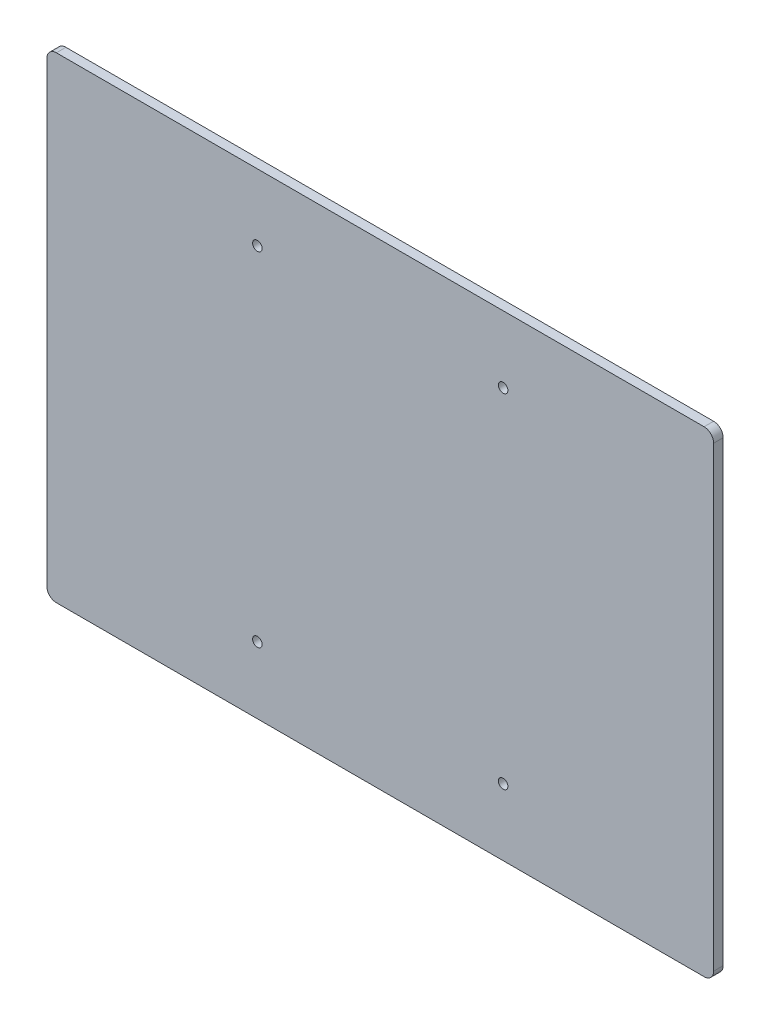
ISO-10303-21;
HEADER;
FILE_DESCRIPTION(('STEP AP214'),'2;1');
FILE_NAME('part.step','',(''),(''),'','','');
FILE_SCHEMA(('AUTOMOTIVE_DESIGN { 1 0 10303 214 1 1 1 1 }'));
ENDSEC;
DATA;
#1=APPLICATION_CONTEXT('core data for automotive mechanical design processes');
#2=APPLICATION_PROTOCOL_DEFINITION('international standard','automotive_design',2000,#1);
#3=PRODUCT_CONTEXT('',#1,'mechanical');
#4=PRODUCT('Part','Part','',(#3));
#5=PRODUCT_RELATED_PRODUCT_CATEGORY('part','',(#4));
#6=PRODUCT_DEFINITION_FORMATION('','',#4);
#7=PRODUCT_DEFINITION_CONTEXT('part definition',#1,'design');
#8=PRODUCT_DEFINITION('design','',#6,#7);
#9=PRODUCT_DEFINITION_SHAPE('','',#8);
#10=(LENGTH_UNIT() NAMED_UNIT(*) SI_UNIT(.MILLI.,.METRE.));
#11=(NAMED_UNIT(*) PLANE_ANGLE_UNIT() SI_UNIT($,.RADIAN.));
#12=(NAMED_UNIT(*) SI_UNIT($,.STERADIAN.) SOLID_ANGLE_UNIT());
#13=UNCERTAINTY_MEASURE_WITH_UNIT(LENGTH_MEASURE(1.E-05),#10,'distance_accuracy_value','');
#14=(GEOMETRIC_REPRESENTATION_CONTEXT(3) GLOBAL_UNCERTAINTY_ASSIGNED_CONTEXT((#13)) GLOBAL_UNIT_ASSIGNED_CONTEXT((#10,
#11,#12)) REPRESENTATION_CONTEXT('',''));
#15=CARTESIAN_POINT('',(0.,0.,0.));
#16=DIRECTION('',(0.,0.,1.));
#17=DIRECTION('',(1.,0.,0.));
#18=AXIS2_PLACEMENT_3D('',#15,#16,#17);
#19=CARTESIAN_POINT('',(-175.,250.,5.));
#20=DIRECTION('',(1.,0.,0.));
#21=DIRECTION('',(0.,1.,0.));
#22=AXIS2_PLACEMENT_3D('',#19,#20,#21);
#23=PLANE('',#22);
#24=DIRECTION('',(0.,-1.,0.));
#25=VECTOR('',#24,1.);
#26=CARTESIAN_POINT('',(-175.,250.,0.));
#27=LINE('',#26,#25);
#28=CARTESIAN_POINT('',(-175.,245.,0.));
#29=VERTEX_POINT('',#28);
#30=CARTESIAN_POINT('',(-175.,5.00000000000003,0.));
#31=VERTEX_POINT('',#30);
#32=EDGE_CURVE('E126',#29,#31,#27,.T.);
#33=ORIENTED_EDGE('',*,*,#32,.T.);
#34=DIRECTION('',(0.,0.,-1.));
#35=VECTOR('',#34,1.);
#36=CARTESIAN_POINT('',(-175.,5.00000000000003,5.));
#37=LINE('',#36,#35);
#38=CARTESIAN_POINT('',(-175.,5.00000000000003,5.));
#39=VERTEX_POINT('',#38);
#40=EDGE_CURVE('E104',#31,#39,#37,.F.);
#41=ORIENTED_EDGE('',*,*,#40,.T.);
#42=DIRECTION('',(0.,-1.,0.));
#43=VECTOR('',#42,1.);
#44=CARTESIAN_POINT('',(-175.,250.,5.));
#45=LINE('',#44,#43);
#46=CARTESIAN_POINT('',(-175.,245.,5.));
#47=VERTEX_POINT('',#46);
#48=EDGE_CURVE('E136',#47,#39,#45,.T.);
#49=ORIENTED_EDGE('',*,*,#48,.F.);
#50=DIRECTION('',(0.,0.,-1.));
#51=VECTOR('',#50,1.);
#52=CARTESIAN_POINT('',(-175.,245.,5.));
#53=LINE('',#52,#51);
#54=EDGE_CURVE('E109',#47,#29,#53,.T.);
#55=ORIENTED_EDGE('',*,*,#54,.T.);
#56=EDGE_LOOP('',(#33,#41,#49,#55));
#57=FACE_BOUND('',#56,.T.);
#58=ADVANCED_FACE('F33',(#57),#23,.F.);
#59=CARTESIAN_POINT('',(-175.,0.,5.));
#60=DIRECTION('',(0.,1.,0.));
#61=DIRECTION('',(0.,0.,1.));
#62=AXIS2_PLACEMENT_3D('',#59,#60,#61);
#63=PLANE('',#62);
#64=DIRECTION('',(1.,0.,0.));
#65=VECTOR('',#64,1.);
#66=CARTESIAN_POINT('',(-175.,0.,5.));
#67=LINE('',#66,#65);
#68=CARTESIAN_POINT('',(-170.,0.,5.));
#69=VERTEX_POINT('',#68);
#70=CARTESIAN_POINT('',(170.,0.,5.));
#71=VERTEX_POINT('',#70);
#72=EDGE_CURVE('E119',#69,#71,#67,.T.);
#73=ORIENTED_EDGE('',*,*,#72,.F.);
#74=DIRECTION('',(0.,0.,-1.));
#75=VECTOR('',#74,1.);
#76=CARTESIAN_POINT('',(-170.,0.,5.));
#77=LINE('',#76,#75);
#78=CARTESIAN_POINT('',(-170.,0.,0.));
#79=VERTEX_POINT('',#78);
#80=EDGE_CURVE('E103',#69,#79,#77,.T.);
#81=ORIENTED_EDGE('',*,*,#80,.T.);
#82=DIRECTION('',(1.,0.,0.));
#83=VECTOR('',#82,1.);
#84=CARTESIAN_POINT('',(-175.,0.,0.));
#85=LINE('',#84,#83);
#86=CARTESIAN_POINT('',(170.,0.,0.));
#87=VERTEX_POINT('',#86);
#88=EDGE_CURVE('E116',#79,#87,#85,.T.);
#89=ORIENTED_EDGE('',*,*,#88,.T.);
#90=DIRECTION('',(0.,0.,-1.));
#91=VECTOR('',#90,1.);
#92=CARTESIAN_POINT('',(170.,0.,5.));
#93=LINE('',#92,#91);
#94=EDGE_CURVE('E121',#87,#71,#93,.F.);
#95=ORIENTED_EDGE('',*,*,#94,.T.);
#96=EDGE_LOOP('',(#73,#81,#89,#95));
#97=FACE_BOUND('',#96,.T.);
#98=ADVANCED_FACE('F115',(#97),#63,.F.);
#99=CARTESIAN_POINT('',(175.,250.,5.));
#100=DIRECTION('',(-1.,0.,0.));
#101=DIRECTION('',(0.,-1.,0.));
#102=AXIS2_PLACEMENT_3D('',#99,#100,#101);
#103=PLANE('',#102);
#104=DIRECTION('',(0.,1.,0.));
#105=VECTOR('',#104,1.);
#106=CARTESIAN_POINT('',(175.,250.,5.));
#107=LINE('',#106,#105);
#108=CARTESIAN_POINT('',(175.,5.00000000000003,5.));
#109=VERTEX_POINT('',#108);
#110=CARTESIAN_POINT('',(175.,245.,5.));
#111=VERTEX_POINT('',#110);
#112=EDGE_CURVE('E162',#109,#111,#107,.T.);
#113=ORIENTED_EDGE('',*,*,#112,.F.);
#114=DIRECTION('',(0.,0.,-1.));
#115=VECTOR('',#114,1.);
#116=CARTESIAN_POINT('',(175.,5.00000000000003,5.));
#117=LINE('',#116,#115);
#118=CARTESIAN_POINT('',(175.,5.00000000000003,0.));
#119=VERTEX_POINT('',#118);
#120=EDGE_CURVE('E155',#109,#119,#117,.T.);
#121=ORIENTED_EDGE('',*,*,#120,.T.);
#122=DIRECTION('',(0.,1.,0.));
#123=VECTOR('',#122,1.);
#124=CARTESIAN_POINT('',(175.,250.,0.));
#125=LINE('',#124,#123);
#126=CARTESIAN_POINT('',(175.,245.,0.));
#127=VERTEX_POINT('',#126);
#128=EDGE_CURVE('E125',#119,#127,#125,.T.);
#129=ORIENTED_EDGE('',*,*,#128,.T.);
#130=DIRECTION('',(0.,0.,-1.));
#131=VECTOR('',#130,1.);
#132=CARTESIAN_POINT('',(175.,245.,5.));
#133=LINE('',#132,#131);
#134=EDGE_CURVE('E153',#127,#111,#133,.F.);
#135=ORIENTED_EDGE('',*,*,#134,.T.);
#136=EDGE_LOOP('',(#113,#121,#129,#135));
#137=FACE_BOUND('',#136,.T.);
#138=ADVANCED_FACE('F160',(#137),#103,.F.);
#139=CARTESIAN_POINT('',(-175.,250.,5.));
#140=DIRECTION('',(0.,-1.,0.));
#141=DIRECTION('',(1.,0.,0.));
#142=AXIS2_PLACEMENT_3D('',#139,#140,#141);
#143=PLANE('',#142);
#144=DIRECTION('',(-1.,0.,0.));
#145=VECTOR('',#144,1.);
#146=CARTESIAN_POINT('',(-175.,250.,5.));
#147=LINE('',#146,#145);
#148=CARTESIAN_POINT('',(170.,250.,5.));
#149=VERTEX_POINT('',#148);
#150=CARTESIAN_POINT('',(-170.,250.,5.));
#151=VERTEX_POINT('',#150);
#152=EDGE_CURVE('E137',#149,#151,#147,.T.);
#153=ORIENTED_EDGE('',*,*,#152,.F.);
#154=DIRECTION('',(0.,0.,-1.));
#155=VECTOR('',#154,1.);
#156=CARTESIAN_POINT('',(170.,250.,5.));
#157=LINE('',#156,#155);
#158=CARTESIAN_POINT('',(170.,250.,0.));
#159=VERTEX_POINT('',#158);
#160=EDGE_CURVE('E11',#149,#159,#157,.T.);
#161=ORIENTED_EDGE('',*,*,#160,.T.);
#162=DIRECTION('',(-1.,0.,0.));
#163=VECTOR('',#162,1.);
#164=CARTESIAN_POINT('',(-175.,250.,0.));
#165=LINE('',#164,#163);
#166=CARTESIAN_POINT('',(-170.,250.,0.));
#167=VERTEX_POINT('',#166);
#168=EDGE_CURVE('E129',#159,#167,#165,.T.);
#169=ORIENTED_EDGE('',*,*,#168,.T.);
#170=DIRECTION('',(0.,0.,-1.));
#171=VECTOR('',#170,1.);
#172=CARTESIAN_POINT('',(-170.,250.,5.));
#173=LINE('',#172,#171);
#174=EDGE_CURVE('E41',#167,#151,#173,.F.);
#175=ORIENTED_EDGE('',*,*,#174,.T.);
#176=EDGE_LOOP('',(#153,#161,#169,#175));
#177=FACE_BOUND('',#176,.T.);
#178=ADVANCED_FACE('F169',(#177),#143,.F.);
#179=CARTESIAN_POINT('',(0.,0.,5.));
#180=DIRECTION('',(0.,0.,1.));
#181=DIRECTION('',(1.,0.,0.));
#182=AXIS2_PLACEMENT_3D('',#179,#180,#181);
#183=PLANE('',#182);
#184=CARTESIAN_POINT('',(64.5,215.,5.));
#185=DIRECTION('',(0.,0.,1.));
#186=DIRECTION('',(1.,0.,0.));
#187=AXIS2_PLACEMENT_3D('',#184,#185,#186);
#188=CIRCLE('',#187,2.50000000000001);
#189=CARTESIAN_POINT('',(67.0000000000001,215.,5.));
#190=VERTEX_POINT('',#189);
#191=EDGE_CURVE('E131',#190,#190,#188,.F.);
#192=ORIENTED_EDGE('',*,*,#191,.T.);
#193=EDGE_LOOP('',(#192));
#194=FACE_BOUND('',#193,.T.);
#195=CARTESIAN_POINT('',(-64.5,215.,5.));
#196=DIRECTION('',(0.,0.,1.));
#197=DIRECTION('',(1.,0.,0.));
#198=AXIS2_PLACEMENT_3D('',#195,#196,#197);
#199=CIRCLE('',#198,2.50000000000001);
#200=CARTESIAN_POINT('',(-62.,215.,5.));
#201=VERTEX_POINT('',#200);
#202=EDGE_CURVE('E178',#201,#201,#199,.F.);
#203=ORIENTED_EDGE('',*,*,#202,.T.);
#204=EDGE_LOOP('',(#203));
#205=FACE_BOUND('',#204,.T.);
#206=CARTESIAN_POINT('',(-64.5,35.,5.));
#207=DIRECTION('',(0.,0.,1.));
#208=DIRECTION('',(1.,0.,0.));
#209=AXIS2_PLACEMENT_3D('',#206,#207,#208);
#210=CIRCLE('',#209,2.50000000000001);
#211=CARTESIAN_POINT('',(-62.,35.,5.));
#212=VERTEX_POINT('',#211);
#213=EDGE_CURVE('E181',#212,#212,#210,.F.);
#214=ORIENTED_EDGE('',*,*,#213,.T.);
#215=EDGE_LOOP('',(#214));
#216=FACE_BOUND('',#215,.T.);
#217=CARTESIAN_POINT('',(64.5,35.,5.));
#218=DIRECTION('',(0.,0.,1.));
#219=DIRECTION('',(1.,0.,0.));
#220=AXIS2_PLACEMENT_3D('',#217,#218,#219);
#221=CIRCLE('',#220,2.50000000000001);
#222=CARTESIAN_POINT('',(67.,35.,5.));
#223=VERTEX_POINT('',#222);
#224=EDGE_CURVE('E184',#223,#223,#221,.F.);
#225=ORIENTED_EDGE('',*,*,#224,.T.);
#226=EDGE_LOOP('',(#225));
#227=FACE_BOUND('',#226,.T.);
#228=ORIENTED_EDGE('',*,*,#48,.T.);
#229=CARTESIAN_POINT('',(-170.,5.00000000000002,5.));
#230=DIRECTION('',(0.,0.,1.));
#231=DIRECTION('',(1.,0.,0.));
#232=AXIS2_PLACEMENT_3D('',#229,#230,#231);
#233=CIRCLE('',#232,5.);
#234=EDGE_CURVE('E151',#39,#69,#233,.T.);
#235=ORIENTED_EDGE('',*,*,#234,.T.);
#236=ORIENTED_EDGE('',*,*,#72,.T.);
#237=CARTESIAN_POINT('',(170.,5.00000000000003,5.));
#238=DIRECTION('',(0.,0.,1.));
#239=DIRECTION('',(1.,0.,0.));
#240=AXIS2_PLACEMENT_3D('',#237,#238,#239);
#241=CIRCLE('',#240,5.);
#242=EDGE_CURVE('E149',#71,#109,#241,.T.);
#243=ORIENTED_EDGE('',*,*,#242,.T.);
#244=ORIENTED_EDGE('',*,*,#112,.T.);
#245=CARTESIAN_POINT('',(170.,245.,5.));
#246=DIRECTION('',(0.,0.,1.));
#247=DIRECTION('',(1.,0.,0.));
#248=AXIS2_PLACEMENT_3D('',#245,#246,#247);
#249=CIRCLE('',#248,5.);
#250=EDGE_CURVE('E54',#111,#149,#249,.T.);
#251=ORIENTED_EDGE('',*,*,#250,.T.);
#252=ORIENTED_EDGE('',*,*,#152,.T.);
#253=CARTESIAN_POINT('',(-170.,245.,5.));
#254=DIRECTION('',(0.,0.,1.));
#255=DIRECTION('',(1.,0.,0.));
#256=AXIS2_PLACEMENT_3D('',#253,#254,#255);
#257=CIRCLE('',#256,5.);
#258=EDGE_CURVE('E146',#151,#47,#257,.T.);
#259=ORIENTED_EDGE('',*,*,#258,.T.);
#260=EDGE_LOOP('',(#228,#235,#236,#243,#244,#251,#252,#259));
#261=FACE_BOUND('',#260,.T.);
#262=ADVANCED_FACE('F240',(#194,#205,#216,#227,#261),#183,.T.);
#263=CARTESIAN_POINT('',(0.,0.,0.));
#264=DIRECTION('',(0.,0.,1.));
#265=DIRECTION('',(1.,0.,0.));
#266=AXIS2_PLACEMENT_3D('',#263,#264,#265);
#267=PLANE('',#266);
#268=CARTESIAN_POINT('',(64.5,215.,0.));
#269=DIRECTION('',(0.,0.,1.));
#270=DIRECTION('',(-1.,0.,0.));
#271=AXIS2_PLACEMENT_3D('',#268,#269,#270);
#272=CIRCLE('',#271,2.50000000000001);
#273=CARTESIAN_POINT('',(62.,215.,0.));
#274=VERTEX_POINT('',#273);
#275=EDGE_CURVE('E191',#274,#274,#272,.T.);
#276=ORIENTED_EDGE('',*,*,#275,.T.);
#277=EDGE_LOOP('',(#276));
#278=FACE_BOUND('',#277,.T.);
#279=CARTESIAN_POINT('',(-64.5,215.,0.));
#280=DIRECTION('',(0.,0.,1.));
#281=DIRECTION('',(1.,0.,0.));
#282=AXIS2_PLACEMENT_3D('',#279,#280,#281);
#283=CIRCLE('',#282,2.50000000000001);
#284=CARTESIAN_POINT('',(-62.,215.,0.));
#285=VERTEX_POINT('',#284);
#286=EDGE_CURVE('E194',#285,#285,#283,.T.);
#287=ORIENTED_EDGE('',*,*,#286,.T.);
#288=EDGE_LOOP('',(#287));
#289=FACE_BOUND('',#288,.T.);
#290=CARTESIAN_POINT('',(-64.5,35.,0.));
#291=DIRECTION('',(0.,0.,1.));
#292=DIRECTION('',(-1.,0.,0.));
#293=AXIS2_PLACEMENT_3D('',#290,#291,#292);
#294=CIRCLE('',#293,2.50000000000001);
#295=CARTESIAN_POINT('',(-67.,35.,0.));
#296=VERTEX_POINT('',#295);
#297=EDGE_CURVE('E190',#296,#296,#294,.T.);
#298=ORIENTED_EDGE('',*,*,#297,.T.);
#299=EDGE_LOOP('',(#298));
#300=FACE_BOUND('',#299,.T.);
#301=CARTESIAN_POINT('',(64.5,35.,0.));
#302=DIRECTION('',(0.,0.,1.));
#303=DIRECTION('',(1.,0.,0.));
#304=AXIS2_PLACEMENT_3D('',#301,#302,#303);
#305=CIRCLE('',#304,2.50000000000001);
#306=CARTESIAN_POINT('',(67.,35.,0.));
#307=VERTEX_POINT('',#306);
#308=EDGE_CURVE('E187',#307,#307,#305,.T.);
#309=ORIENTED_EDGE('',*,*,#308,.T.);
#310=EDGE_LOOP('',(#309));
#311=FACE_BOUND('',#310,.T.);
#312=ORIENTED_EDGE('',*,*,#88,.F.);
#313=CARTESIAN_POINT('',(-170.,5.00000000000002,0.));
#314=DIRECTION('',(0.,0.,1.));
#315=DIRECTION('',(1.,0.,0.));
#316=AXIS2_PLACEMENT_3D('',#313,#314,#315);
#317=CIRCLE('',#316,5.);
#318=EDGE_CURVE('E99',#79,#31,#317,.F.);
#319=ORIENTED_EDGE('',*,*,#318,.T.);
#320=ORIENTED_EDGE('',*,*,#32,.F.);
#321=CARTESIAN_POINT('',(-170.,245.,0.));
#322=DIRECTION('',(0.,0.,1.));
#323=DIRECTION('',(1.,0.,0.));
#324=AXIS2_PLACEMENT_3D('',#321,#322,#323);
#325=CIRCLE('',#324,5.);
#326=EDGE_CURVE('E120',#29,#167,#325,.F.);
#327=ORIENTED_EDGE('',*,*,#326,.T.);
#328=ORIENTED_EDGE('',*,*,#168,.F.);
#329=CARTESIAN_POINT('',(170.,245.,0.));
#330=DIRECTION('',(0.,0.,1.));
#331=DIRECTION('',(1.,0.,0.));
#332=AXIS2_PLACEMENT_3D('',#329,#330,#331);
#333=CIRCLE('',#332,5.);
#334=EDGE_CURVE('E140',#159,#127,#333,.F.);
#335=ORIENTED_EDGE('',*,*,#334,.T.);
#336=ORIENTED_EDGE('',*,*,#128,.F.);
#337=CARTESIAN_POINT('',(170.,5.00000000000003,0.));
#338=DIRECTION('',(0.,0.,1.));
#339=DIRECTION('',(1.,0.,0.));
#340=AXIS2_PLACEMENT_3D('',#337,#338,#339);
#341=CIRCLE('',#340,5.);
#342=EDGE_CURVE('E110',#119,#87,#341,.F.);
#343=ORIENTED_EDGE('',*,*,#342,.T.);
#344=EDGE_LOOP('',(#312,#319,#320,#327,#328,#335,#336,#343));
#345=FACE_BOUND('',#344,.T.);
#346=ADVANCED_FACE('F123',(#278,#289,#300,#311,#345),#267,.F.);
#347=CARTESIAN_POINT('',(-170.,5.00000000000002,5.));
#348=DIRECTION('',(0.,0.,-1.));
#349=DIRECTION('',(-1.,0.,0.));
#350=AXIS2_PLACEMENT_3D('',#347,#348,#349);
#351=CYLINDRICAL_SURFACE('',#350,5.);
#352=ORIENTED_EDGE('',*,*,#234,.F.);
#353=ORIENTED_EDGE('',*,*,#40,.F.);
#354=ORIENTED_EDGE('',*,*,#318,.F.);
#355=ORIENTED_EDGE('',*,*,#80,.F.);
#356=EDGE_LOOP('',(#352,#353,#354,#355));
#357=FACE_BOUND('',#356,.T.);
#358=ADVANCED_FACE('F102',(#357),#351,.T.);
#359=CARTESIAN_POINT('',(170.,5.00000000000003,5.));
#360=DIRECTION('',(0.,0.,-1.));
#361=DIRECTION('',(-1.,0.,0.));
#362=AXIS2_PLACEMENT_3D('',#359,#360,#361);
#363=CYLINDRICAL_SURFACE('',#362,5.);
#364=ORIENTED_EDGE('',*,*,#242,.F.);
#365=ORIENTED_EDGE('',*,*,#94,.F.);
#366=ORIENTED_EDGE('',*,*,#342,.F.);
#367=ORIENTED_EDGE('',*,*,#120,.F.);
#368=EDGE_LOOP('',(#364,#365,#366,#367));
#369=FACE_BOUND('',#368,.T.);
#370=ADVANCED_FACE('F229',(#369),#363,.T.);
#371=CARTESIAN_POINT('',(170.,245.,5.));
#372=DIRECTION('',(0.,0.,-1.));
#373=DIRECTION('',(-1.,0.,0.));
#374=AXIS2_PLACEMENT_3D('',#371,#372,#373);
#375=CYLINDRICAL_SURFACE('',#374,5.);
#376=ORIENTED_EDGE('',*,*,#250,.F.);
#377=ORIENTED_EDGE('',*,*,#134,.F.);
#378=ORIENTED_EDGE('',*,*,#334,.F.);
#379=ORIENTED_EDGE('',*,*,#160,.F.);
#380=EDGE_LOOP('',(#376,#377,#378,#379));
#381=FACE_BOUND('',#380,.T.);
#382=ADVANCED_FACE('F168',(#381),#375,.T.);
#383=CARTESIAN_POINT('',(-170.,245.,5.));
#384=DIRECTION('',(0.,0.,-1.));
#385=DIRECTION('',(-1.,0.,0.));
#386=AXIS2_PLACEMENT_3D('',#383,#384,#385);
#387=CYLINDRICAL_SURFACE('',#386,5.);
#388=ORIENTED_EDGE('',*,*,#258,.F.);
#389=ORIENTED_EDGE('',*,*,#174,.F.);
#390=ORIENTED_EDGE('',*,*,#326,.F.);
#391=ORIENTED_EDGE('',*,*,#54,.F.);
#392=EDGE_LOOP('',(#388,#389,#390,#391));
#393=FACE_BOUND('',#392,.T.);
#394=ADVANCED_FACE('F35',(#393),#387,.T.);
#395=CARTESIAN_POINT('',(64.5,35.,10.));
#396=DIRECTION('',(0.,0.,-1.));
#397=DIRECTION('',(-1.,0.,0.));
#398=AXIS2_PLACEMENT_3D('',#395,#396,#397);
#399=CYLINDRICAL_SURFACE('',#398,2.50000000000001);
#400=ORIENTED_EDGE('',*,*,#224,.F.);
#401=EDGE_LOOP('',(#400));
#402=FACE_BOUND('',#401,.T.);
#403=ORIENTED_EDGE('',*,*,#308,.F.);
#404=EDGE_LOOP('',(#403));
#405=FACE_BOUND('',#404,.T.);
#406=ADVANCED_FACE('F205',(#402,#405),#399,.F.);
#407=CARTESIAN_POINT('',(-64.5,35.,10.));
#408=DIRECTION('',(0.,0.,-1.));
#409=DIRECTION('',(-1.,0.,0.));
#410=AXIS2_PLACEMENT_3D('',#407,#408,#409);
#411=CYLINDRICAL_SURFACE('',#410,2.50000000000001);
#412=ORIENTED_EDGE('',*,*,#213,.F.);
#413=EDGE_LOOP('',(#412));
#414=FACE_BOUND('',#413,.T.);
#415=ORIENTED_EDGE('',*,*,#297,.F.);
#416=EDGE_LOOP('',(#415));
#417=FACE_BOUND('',#416,.T.);
#418=ADVANCED_FACE('F202',(#414,#417),#411,.F.);
#419=CARTESIAN_POINT('',(-64.5,215.,10.));
#420=DIRECTION('',(0.,0.,-1.));
#421=DIRECTION('',(-1.,0.,0.));
#422=AXIS2_PLACEMENT_3D('',#419,#420,#421);
#423=CYLINDRICAL_SURFACE('',#422,2.50000000000001);
#424=ORIENTED_EDGE('',*,*,#202,.F.);
#425=EDGE_LOOP('',(#424));
#426=FACE_BOUND('',#425,.T.);
#427=ORIENTED_EDGE('',*,*,#286,.F.);
#428=EDGE_LOOP('',(#427));
#429=FACE_BOUND('',#428,.T.);
#430=ADVANCED_FACE('F204',(#426,#429),#423,.F.);
#431=CARTESIAN_POINT('',(64.5,215.,10.));
#432=DIRECTION('',(0.,0.,-1.));
#433=DIRECTION('',(-1.,0.,0.));
#434=AXIS2_PLACEMENT_3D('',#431,#432,#433);
#435=CYLINDRICAL_SURFACE('',#434,2.50000000000001);
#436=ORIENTED_EDGE('',*,*,#191,.F.);
#437=EDGE_LOOP('',(#436));
#438=FACE_BOUND('',#437,.T.);
#439=ORIENTED_EDGE('',*,*,#275,.F.);
#440=EDGE_LOOP('',(#439));
#441=FACE_BOUND('',#440,.T.);
#442=ADVANCED_FACE('F212',(#438,#441),#435,.F.);
#443=CLOSED_SHELL('',(#58,#98,#138,#178,#262,#346,#358,#370,#382,#394,#406,#418,#430,#442));
#444=MANIFOLD_SOLID_BREP('B2',#443);
#445=ADVANCED_BREP_SHAPE_REPRESENTATION('',(#18,#444),#14);
#446=SHAPE_DEFINITION_REPRESENTATION(#9,#445);
ENDSEC;
END-ISO-10303-21;
